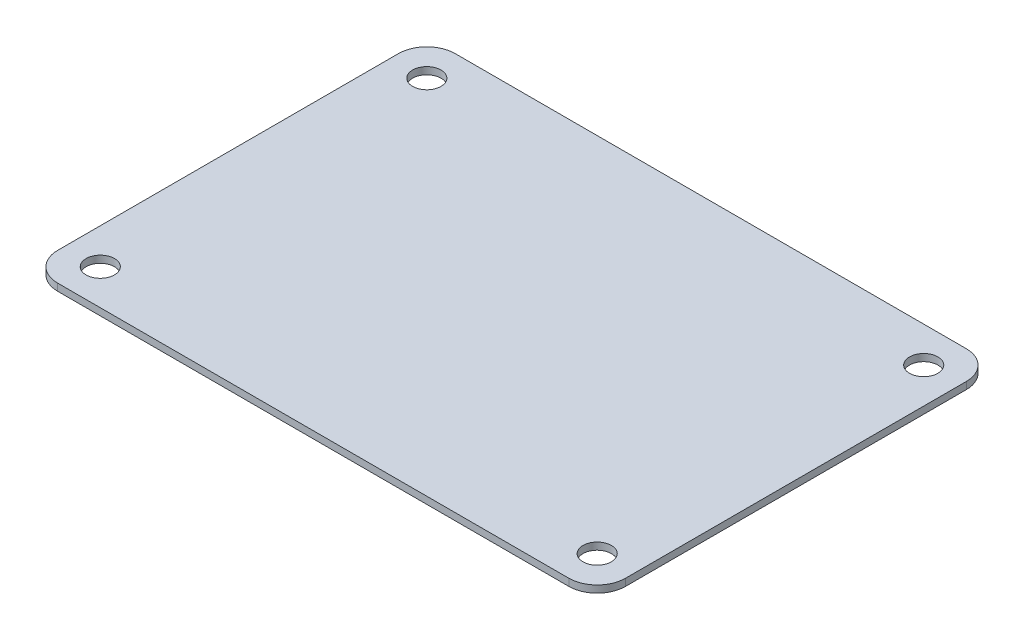
ISO-10303-21;
HEADER;
FILE_DESCRIPTION(('STEP AP214'),'2;1');
FILE_NAME('part.step','',(''),(''),'','','');
FILE_SCHEMA(('AUTOMOTIVE_DESIGN { 1 0 10303 214 1 1 1 1 }'));
ENDSEC;
DATA;
#1=APPLICATION_CONTEXT('core data for automotive mechanical design processes');
#2=APPLICATION_PROTOCOL_DEFINITION('international standard','automotive_design',2000,#1);
#3=PRODUCT_CONTEXT('',#1,'mechanical');
#4=PRODUCT('Part','Part','',(#3));
#5=PRODUCT_RELATED_PRODUCT_CATEGORY('part','',(#4));
#6=PRODUCT_DEFINITION_FORMATION('','',#4);
#7=PRODUCT_DEFINITION_CONTEXT('part definition',#1,'design');
#8=PRODUCT_DEFINITION('design','',#6,#7);
#9=PRODUCT_DEFINITION_SHAPE('','',#8);
#10=(LENGTH_UNIT() NAMED_UNIT(*) SI_UNIT(.MILLI.,.METRE.));
#11=(NAMED_UNIT(*) PLANE_ANGLE_UNIT() SI_UNIT($,.RADIAN.));
#12=(NAMED_UNIT(*) SI_UNIT($,.STERADIAN.) SOLID_ANGLE_UNIT());
#13=UNCERTAINTY_MEASURE_WITH_UNIT(LENGTH_MEASURE(1.E-05),#10,'distance_accuracy_value','');
#14=(GEOMETRIC_REPRESENTATION_CONTEXT(3) GLOBAL_UNCERTAINTY_ASSIGNED_CONTEXT((#13)) GLOBAL_UNIT_ASSIGNED_CONTEXT((#10,
#11,#12)) REPRESENTATION_CONTEXT('',''));
#15=CARTESIAN_POINT('',(0.,0.,0.));
#16=DIRECTION('',(0.,0.,1.));
#17=DIRECTION('',(1.,0.,0.));
#18=AXIS2_PLACEMENT_3D('',#15,#16,#17);
#19=CARTESIAN_POINT('',(0.,3.175,0.));
#20=DIRECTION('',(0.,1.,0.));
#21=DIRECTION('',(0.,0.,1.));
#22=AXIS2_PLACEMENT_3D('',#19,#20,#21);
#23=PLANE('',#22);
#24=CARTESIAN_POINT('',(111.125,3.175,-73.025));
#25=DIRECTION('',(0.,1.,0.));
#26=DIRECTION('',(0.,0.,1.));
#27=AXIS2_PLACEMENT_3D('',#24,#25,#26);
#28=CIRCLE('',#27,6.34999999999999);
#29=CARTESIAN_POINT('',(111.125,3.175,-66.675));
#30=VERTEX_POINT('',#29);
#31=EDGE_CURVE('E222',#30,#30,#28,.T.);
#32=ORIENTED_EDGE('',*,*,#31,.F.);
#33=EDGE_LOOP('',(#32));
#34=FACE_BOUND('',#33,.T.);
#35=CARTESIAN_POINT('',(-111.125,3.175,73.025));
#36=DIRECTION('',(0.,1.,0.));
#37=DIRECTION('',(0.,0.,1.));
#38=AXIS2_PLACEMENT_3D('',#35,#36,#37);
#39=CIRCLE('',#38,6.34999999999999);
#40=CARTESIAN_POINT('',(-111.125,3.175,79.375));
#41=VERTEX_POINT('',#40);
#42=EDGE_CURVE('E142',#41,#41,#39,.T.);
#43=ORIENTED_EDGE('',*,*,#42,.F.);
#44=EDGE_LOOP('',(#43));
#45=FACE_BOUND('',#44,.T.);
#46=DIRECTION('',(-1.,0.,0.));
#47=VECTOR('',#46,1.);
#48=CARTESIAN_POINT('',(-127.,3.175,-88.9));
#49=LINE('',#48,#47);
#50=CARTESIAN_POINT('',(114.3,3.175,-88.9));
#51=VERTEX_POINT('',#50);
#52=CARTESIAN_POINT('',(-114.3,3.175,-88.9));
#53=VERTEX_POINT('',#52);
#54=EDGE_CURVE('E152',#51,#53,#49,.T.);
#55=ORIENTED_EDGE('',*,*,#54,.T.);
#56=CARTESIAN_POINT('',(-114.3,3.175,-76.2));
#57=DIRECTION('',(0.,1.,0.));
#58=DIRECTION('',(0.,0.,1.));
#59=AXIS2_PLACEMENT_3D('',#56,#57,#58);
#60=CIRCLE('',#59,12.7);
#61=CARTESIAN_POINT('',(-127.,3.175,-76.2));
#62=VERTEX_POINT('',#61);
#63=EDGE_CURVE('E198',#53,#62,#60,.T.);
#64=ORIENTED_EDGE('',*,*,#63,.T.);
#65=DIRECTION('',(0.,0.,1.));
#66=VECTOR('',#65,1.);
#67=CARTESIAN_POINT('',(-127.,3.175,-88.9));
#68=LINE('',#67,#66);
#69=CARTESIAN_POINT('',(-127.,3.175,76.2));
#70=VERTEX_POINT('',#69);
#71=EDGE_CURVE('E132',#62,#70,#68,.T.);
#72=ORIENTED_EDGE('',*,*,#71,.T.);
#73=CARTESIAN_POINT('',(-114.3,3.175,76.2));
#74=DIRECTION('',(0.,1.,0.));
#75=DIRECTION('',(0.,0.,1.));
#76=AXIS2_PLACEMENT_3D('',#73,#74,#75);
#77=CIRCLE('',#76,12.7);
#78=CARTESIAN_POINT('',(-114.3,3.175,88.9));
#79=VERTEX_POINT('',#78);
#80=EDGE_CURVE('E195',#70,#79,#77,.T.);
#81=ORIENTED_EDGE('',*,*,#80,.T.);
#82=DIRECTION('',(1.,0.,0.));
#83=VECTOR('',#82,1.);
#84=CARTESIAN_POINT('',(-127.,3.175,88.9));
#85=LINE('',#84,#83);
#86=CARTESIAN_POINT('',(114.3,3.175,88.9));
#87=VERTEX_POINT('',#86);
#88=EDGE_CURVE('E184',#79,#87,#85,.T.);
#89=ORIENTED_EDGE('',*,*,#88,.T.);
#90=CARTESIAN_POINT('',(114.3,3.175,76.2));
#91=DIRECTION('',(0.,1.,0.));
#92=DIRECTION('',(0.,0.,1.));
#93=AXIS2_PLACEMENT_3D('',#90,#91,#92);
#94=CIRCLE('',#93,12.7);
#95=CARTESIAN_POINT('',(127.,3.175,76.2));
#96=VERTEX_POINT('',#95);
#97=EDGE_CURVE('E62',#87,#96,#94,.T.);
#98=ORIENTED_EDGE('',*,*,#97,.T.);
#99=DIRECTION('',(0.,0.,-1.));
#100=VECTOR('',#99,1.);
#101=CARTESIAN_POINT('',(127.,3.175,-88.9));
#102=LINE('',#101,#100);
#103=CARTESIAN_POINT('',(127.,3.175,-76.2));
#104=VERTEX_POINT('',#103);
#105=EDGE_CURVE('E181',#96,#104,#102,.T.);
#106=ORIENTED_EDGE('',*,*,#105,.T.);
#107=CARTESIAN_POINT('',(114.3,3.175,-76.2));
#108=DIRECTION('',(0.,1.,0.));
#109=DIRECTION('',(0.,0.,1.));
#110=AXIS2_PLACEMENT_3D('',#107,#108,#109);
#111=CIRCLE('',#110,12.7);
#112=EDGE_CURVE('E172',#104,#51,#111,.T.);
#113=ORIENTED_EDGE('',*,*,#112,.T.);
#114=EDGE_LOOP('',(#55,#64,#72,#81,#89,#98,#106,#113));
#115=FACE_BOUND('',#114,.T.);
#116=CARTESIAN_POINT('',(-111.125,3.175,-73.025));
#117=DIRECTION('',(0.,1.,0.));
#118=DIRECTION('',(0.,0.,1.));
#119=AXIS2_PLACEMENT_3D('',#116,#117,#118);
#120=CIRCLE('',#119,6.34999999999999);
#121=CARTESIAN_POINT('',(-111.125,3.175,-66.675));
#122=VERTEX_POINT('',#121);
#123=EDGE_CURVE('E246',#122,#122,#120,.T.);
#124=ORIENTED_EDGE('',*,*,#123,.F.);
#125=EDGE_LOOP('',(#124));
#126=FACE_BOUND('',#125,.T.);
#127=CARTESIAN_POINT('',(111.125,3.175,73.025));
#128=DIRECTION('',(0.,1.,0.));
#129=DIRECTION('',(0.,0.,1.));
#130=AXIS2_PLACEMENT_3D('',#127,#128,#129);
#131=CIRCLE('',#130,6.34999999999999);
#132=CARTESIAN_POINT('',(111.125,3.175,79.375));
#133=VERTEX_POINT('',#132);
#134=EDGE_CURVE('E229',#133,#133,#131,.T.);
#135=ORIENTED_EDGE('',*,*,#134,.F.);
#136=EDGE_LOOP('',(#135));
#137=FACE_BOUND('',#136,.T.);
#138=ADVANCED_FACE('F42',(#34,#45,#115,#126,#137),#23,.T.);
#139=CARTESIAN_POINT('',(0.,0.,0.));
#140=DIRECTION('',(0.,1.,0.));
#141=DIRECTION('',(0.,0.,1.));
#142=AXIS2_PLACEMENT_3D('',#139,#140,#141);
#143=PLANE('',#142);
#144=DIRECTION('',(0.,0.,1.));
#145=VECTOR('',#144,1.);
#146=CARTESIAN_POINT('',(-127.,0.,-88.9));
#147=LINE('',#146,#145);
#148=CARTESIAN_POINT('',(-127.,0.,-76.2));
#149=VERTEX_POINT('',#148);
#150=CARTESIAN_POINT('',(-127.,0.,76.2));
#151=VERTEX_POINT('',#150);
#152=EDGE_CURVE('E129',#149,#151,#147,.T.);
#153=ORIENTED_EDGE('',*,*,#152,.F.);
#154=CARTESIAN_POINT('',(-114.3,0.,-76.2));
#155=DIRECTION('',(0.,1.,0.));
#156=DIRECTION('',(0.,0.,1.));
#157=AXIS2_PLACEMENT_3D('',#154,#155,#156);
#158=CIRCLE('',#157,12.7);
#159=CARTESIAN_POINT('',(-114.3,0.,-88.9));
#160=VERTEX_POINT('',#159);
#161=EDGE_CURVE('E111',#149,#160,#158,.F.);
#162=ORIENTED_EDGE('',*,*,#161,.T.);
#163=DIRECTION('',(-1.,0.,0.));
#164=VECTOR('',#163,1.);
#165=CARTESIAN_POINT('',(-127.,0.,-88.9));
#166=LINE('',#165,#164);
#167=CARTESIAN_POINT('',(114.3,0.,-88.9));
#168=VERTEX_POINT('',#167);
#169=EDGE_CURVE('E157',#168,#160,#166,.T.);
#170=ORIENTED_EDGE('',*,*,#169,.F.);
#171=CARTESIAN_POINT('',(114.3,0.,-76.2));
#172=DIRECTION('',(0.,1.,0.));
#173=DIRECTION('',(0.,0.,1.));
#174=AXIS2_PLACEMENT_3D('',#171,#172,#173);
#175=CIRCLE('',#174,12.7);
#176=CARTESIAN_POINT('',(127.,0.,-76.2));
#177=VERTEX_POINT('',#176);
#178=EDGE_CURVE('E162',#168,#177,#175,.F.);
#179=ORIENTED_EDGE('',*,*,#178,.T.);
#180=DIRECTION('',(0.,0.,-1.));
#181=VECTOR('',#180,1.);
#182=CARTESIAN_POINT('',(127.,0.,-88.9));
#183=LINE('',#182,#181);
#184=CARTESIAN_POINT('',(127.,0.,76.2));
#185=VERTEX_POINT('',#184);
#186=EDGE_CURVE('E145',#185,#177,#183,.T.);
#187=ORIENTED_EDGE('',*,*,#186,.F.);
#188=CARTESIAN_POINT('',(114.3,0.,76.2));
#189=DIRECTION('',(0.,1.,0.));
#190=DIRECTION('',(0.,0.,1.));
#191=AXIS2_PLACEMENT_3D('',#188,#189,#190);
#192=CIRCLE('',#191,12.7);
#193=CARTESIAN_POINT('',(114.3,0.,88.9));
#194=VERTEX_POINT('',#193);
#195=EDGE_CURVE('E134',#185,#194,#192,.F.);
#196=ORIENTED_EDGE('',*,*,#195,.T.);
#197=DIRECTION('',(1.,0.,0.));
#198=VECTOR('',#197,1.);
#199=CARTESIAN_POINT('',(-127.,0.,88.9));
#200=LINE('',#199,#198);
#201=CARTESIAN_POINT('',(-114.3,0.,88.9));
#202=VERTEX_POINT('',#201);
#203=EDGE_CURVE('E141',#202,#194,#200,.T.);
#204=ORIENTED_EDGE('',*,*,#203,.F.);
#205=CARTESIAN_POINT('',(-114.3,0.,76.2));
#206=DIRECTION('',(0.,1.,0.));
#207=DIRECTION('',(0.,0.,1.));
#208=AXIS2_PLACEMENT_3D('',#205,#206,#207);
#209=CIRCLE('',#208,12.7);
#210=EDGE_CURVE('E123',#202,#151,#209,.F.);
#211=ORIENTED_EDGE('',*,*,#210,.T.);
#212=EDGE_LOOP('',(#153,#162,#170,#179,#187,#196,#204,#211));
#213=FACE_BOUND('',#212,.T.);
#214=CARTESIAN_POINT('',(-111.125,0.,73.025));
#215=DIRECTION('',(0.,1.,0.));
#216=DIRECTION('',(0.,0.,1.));
#217=AXIS2_PLACEMENT_3D('',#214,#215,#216);
#218=CIRCLE('',#217,6.34999999999999);
#219=CARTESIAN_POINT('',(-111.125,0.,79.375));
#220=VERTEX_POINT('',#219);
#221=EDGE_CURVE('E149',#220,#220,#218,.T.);
#222=ORIENTED_EDGE('',*,*,#221,.T.);
#223=EDGE_LOOP('',(#222));
#224=FACE_BOUND('',#223,.T.);
#225=CARTESIAN_POINT('',(-111.125,0.,-73.025));
#226=DIRECTION('',(0.,1.,0.));
#227=DIRECTION('',(0.,0.,1.));
#228=AXIS2_PLACEMENT_3D('',#225,#226,#227);
#229=CIRCLE('',#228,6.34999999999999);
#230=CARTESIAN_POINT('',(-111.125,0.,-66.675));
#231=VERTEX_POINT('',#230);
#232=EDGE_CURVE('E224',#231,#231,#229,.T.);
#233=ORIENTED_EDGE('',*,*,#232,.T.);
#234=EDGE_LOOP('',(#233));
#235=FACE_BOUND('',#234,.T.);
#236=CARTESIAN_POINT('',(111.125,0.,-73.025));
#237=DIRECTION('',(0.,1.,0.));
#238=DIRECTION('',(0.,0.,1.));
#239=AXIS2_PLACEMENT_3D('',#236,#237,#238);
#240=CIRCLE('',#239,6.34999999999999);
#241=CARTESIAN_POINT('',(111.125,0.,-66.675));
#242=VERTEX_POINT('',#241);
#243=EDGE_CURVE('E225',#242,#242,#240,.T.);
#244=ORIENTED_EDGE('',*,*,#243,.T.);
#245=EDGE_LOOP('',(#244));
#246=FACE_BOUND('',#245,.T.);
#247=CARTESIAN_POINT('',(111.125,0.,73.025));
#248=DIRECTION('',(0.,1.,0.));
#249=DIRECTION('',(0.,0.,1.));
#250=AXIS2_PLACEMENT_3D('',#247,#248,#249);
#251=CIRCLE('',#250,6.34999999999999);
#252=CARTESIAN_POINT('',(111.125,0.,79.375));
#253=VERTEX_POINT('',#252);
#254=EDGE_CURVE('E231',#253,#253,#251,.T.);
#255=ORIENTED_EDGE('',*,*,#254,.T.);
#256=EDGE_LOOP('',(#255));
#257=FACE_BOUND('',#256,.T.);
#258=ADVANCED_FACE('F137',(#213,#224,#235,#246,#257),#143,.F.);
#259=CARTESIAN_POINT('',(-127.,3.175,-88.9));
#260=DIRECTION('',(1.,0.,0.));
#261=DIRECTION('',(0.,0.,-1.));
#262=AXIS2_PLACEMENT_3D('',#259,#260,#261);
#263=PLANE('',#262);
#264=ORIENTED_EDGE('',*,*,#71,.F.);
#265=DIRECTION('',(0.,-1.,0.));
#266=VECTOR('',#265,1.);
#267=CARTESIAN_POINT('',(-127.,3.175,-76.2));
#268=LINE('',#267,#266);
#269=EDGE_CURVE('E115',#62,#149,#268,.T.);
#270=ORIENTED_EDGE('',*,*,#269,.T.);
#271=ORIENTED_EDGE('',*,*,#152,.T.);
#272=DIRECTION('',(0.,-1.,0.));
#273=VECTOR('',#272,1.);
#274=CARTESIAN_POINT('',(-127.,3.175,76.2));
#275=LINE('',#274,#273);
#276=EDGE_CURVE('E135',#151,#70,#275,.F.);
#277=ORIENTED_EDGE('',*,*,#276,.T.);
#278=EDGE_LOOP('',(#264,#270,#271,#277));
#279=FACE_BOUND('',#278,.T.);
#280=ADVANCED_FACE('F128',(#279),#263,.F.);
#281=CARTESIAN_POINT('',(-127.,3.175,88.9));
#282=DIRECTION('',(0.,0.,-1.));
#283=DIRECTION('',(-1.,0.,0.));
#284=AXIS2_PLACEMENT_3D('',#281,#282,#283);
#285=PLANE('',#284);
#286=ORIENTED_EDGE('',*,*,#88,.F.);
#287=DIRECTION('',(0.,-1.,0.));
#288=VECTOR('',#287,1.);
#289=CARTESIAN_POINT('',(-114.3,3.175,88.9));
#290=LINE('',#289,#288);
#291=EDGE_CURVE('E204',#79,#202,#290,.T.);
#292=ORIENTED_EDGE('',*,*,#291,.T.);
#293=ORIENTED_EDGE('',*,*,#203,.T.);
#294=DIRECTION('',(0.,-1.,0.));
#295=VECTOR('',#294,1.);
#296=CARTESIAN_POINT('',(114.3,3.175,88.9));
#297=LINE('',#296,#295);
#298=EDGE_CURVE('E202',#194,#87,#297,.F.);
#299=ORIENTED_EDGE('',*,*,#298,.T.);
#300=EDGE_LOOP('',(#286,#292,#293,#299));
#301=FACE_BOUND('',#300,.T.);
#302=ADVANCED_FACE('F280',(#301),#285,.F.);
#303=CARTESIAN_POINT('',(127.,3.175,-88.9));
#304=DIRECTION('',(-1.,0.,0.));
#305=DIRECTION('',(0.,0.,1.));
#306=AXIS2_PLACEMENT_3D('',#303,#304,#305);
#307=PLANE('',#306);
#308=ORIENTED_EDGE('',*,*,#186,.T.);
#309=DIRECTION('',(0.,-1.,0.));
#310=VECTOR('',#309,1.);
#311=CARTESIAN_POINT('',(127.,3.175,-76.2));
#312=LINE('',#311,#310);
#313=EDGE_CURVE('E12',#177,#104,#312,.F.);
#314=ORIENTED_EDGE('',*,*,#313,.T.);
#315=ORIENTED_EDGE('',*,*,#105,.F.);
#316=DIRECTION('',(0.,-1.,0.));
#317=VECTOR('',#316,1.);
#318=CARTESIAN_POINT('',(127.,3.175,76.2));
#319=LINE('',#318,#317);
#320=EDGE_CURVE('E50',#96,#185,#319,.T.);
#321=ORIENTED_EDGE('',*,*,#320,.T.);
#322=EDGE_LOOP('',(#308,#314,#315,#321));
#323=FACE_BOUND('',#322,.T.);
#324=ADVANCED_FACE('F209',(#323),#307,.F.);
#325=CARTESIAN_POINT('',(-127.,3.175,-88.9));
#326=DIRECTION('',(0.,0.,1.));
#327=DIRECTION('',(1.,0.,0.));
#328=AXIS2_PLACEMENT_3D('',#325,#326,#327);
#329=PLANE('',#328);
#330=ORIENTED_EDGE('',*,*,#169,.T.);
#331=DIRECTION('',(0.,-1.,0.));
#332=VECTOR('',#331,1.);
#333=CARTESIAN_POINT('',(-114.3,3.175,-88.9));
#334=LINE('',#333,#332);
#335=EDGE_CURVE('E116',#160,#53,#334,.F.);
#336=ORIENTED_EDGE('',*,*,#335,.T.);
#337=ORIENTED_EDGE('',*,*,#54,.F.);
#338=DIRECTION('',(0.,-1.,0.));
#339=VECTOR('',#338,1.);
#340=CARTESIAN_POINT('',(114.3,3.175,-88.9));
#341=LINE('',#340,#339);
#342=EDGE_CURVE('E122',#51,#168,#341,.T.);
#343=ORIENTED_EDGE('',*,*,#342,.T.);
#344=EDGE_LOOP('',(#330,#336,#337,#343));
#345=FACE_BOUND('',#344,.T.);
#346=ADVANCED_FACE('F217',(#345),#329,.F.);
#347=CARTESIAN_POINT('',(-111.125,3.175,73.025));
#348=DIRECTION('',(0.,-1.,0.));
#349=DIRECTION('',(0.,0.,-1.));
#350=AXIS2_PLACEMENT_3D('',#347,#348,#349);
#351=CYLINDRICAL_SURFACE('',#350,6.34999999999999);
#352=ORIENTED_EDGE('',*,*,#42,.T.);
#353=EDGE_LOOP('',(#352));
#354=FACE_BOUND('',#353,.T.);
#355=ORIENTED_EDGE('',*,*,#221,.F.);
#356=EDGE_LOOP('',(#355));
#357=FACE_BOUND('',#356,.T.);
#358=ADVANCED_FACE('F256',(#354,#357),#351,.F.);
#359=CARTESIAN_POINT('',(-111.125,3.175,-73.025));
#360=DIRECTION('',(0.,-1.,0.));
#361=DIRECTION('',(0.,0.,-1.));
#362=AXIS2_PLACEMENT_3D('',#359,#360,#361);
#363=CYLINDRICAL_SURFACE('',#362,6.34999999999999);
#364=ORIENTED_EDGE('',*,*,#123,.T.);
#365=EDGE_LOOP('',(#364));
#366=FACE_BOUND('',#365,.T.);
#367=ORIENTED_EDGE('',*,*,#232,.F.);
#368=EDGE_LOOP('',(#367));
#369=FACE_BOUND('',#368,.T.);
#370=ADVANCED_FACE('F258',(#366,#369),#363,.F.);
#371=CARTESIAN_POINT('',(111.125,3.175,-73.025));
#372=DIRECTION('',(0.,-1.,0.));
#373=DIRECTION('',(0.,0.,-1.));
#374=AXIS2_PLACEMENT_3D('',#371,#372,#373);
#375=CYLINDRICAL_SURFACE('',#374,6.34999999999999);
#376=ORIENTED_EDGE('',*,*,#31,.T.);
#377=EDGE_LOOP('',(#376));
#378=FACE_BOUND('',#377,.T.);
#379=ORIENTED_EDGE('',*,*,#243,.F.);
#380=EDGE_LOOP('',(#379));
#381=FACE_BOUND('',#380,.T.);
#382=ADVANCED_FACE('F265',(#378,#381),#375,.F.);
#383=CARTESIAN_POINT('',(111.125,3.175,73.025));
#384=DIRECTION('',(0.,-1.,0.));
#385=DIRECTION('',(0.,0.,-1.));
#386=AXIS2_PLACEMENT_3D('',#383,#384,#385);
#387=CYLINDRICAL_SURFACE('',#386,6.34999999999999);
#388=ORIENTED_EDGE('',*,*,#134,.T.);
#389=EDGE_LOOP('',(#388));
#390=FACE_BOUND('',#389,.T.);
#391=ORIENTED_EDGE('',*,*,#254,.F.);
#392=EDGE_LOOP('',(#391));
#393=FACE_BOUND('',#392,.T.);
#394=ADVANCED_FACE('F289',(#390,#393),#387,.F.);
#395=CARTESIAN_POINT('',(-114.3,3.175,-76.2));
#396=DIRECTION('',(0.,-1.,0.));
#397=DIRECTION('',(0.,0.,-1.));
#398=AXIS2_PLACEMENT_3D('',#395,#396,#397);
#399=CYLINDRICAL_SURFACE('',#398,12.7);
#400=ORIENTED_EDGE('',*,*,#63,.F.);
#401=ORIENTED_EDGE('',*,*,#335,.F.);
#402=ORIENTED_EDGE('',*,*,#161,.F.);
#403=ORIENTED_EDGE('',*,*,#269,.F.);
#404=EDGE_LOOP('',(#400,#401,#402,#403));
#405=FACE_BOUND('',#404,.T.);
#406=ADVANCED_FACE('F114',(#405),#399,.T.);
#407=CARTESIAN_POINT('',(-114.3,3.175,76.2));
#408=DIRECTION('',(0.,-1.,0.));
#409=DIRECTION('',(0.,0.,-1.));
#410=AXIS2_PLACEMENT_3D('',#407,#408,#409);
#411=CYLINDRICAL_SURFACE('',#410,12.7);
#412=ORIENTED_EDGE('',*,*,#80,.F.);
#413=ORIENTED_EDGE('',*,*,#276,.F.);
#414=ORIENTED_EDGE('',*,*,#210,.F.);
#415=ORIENTED_EDGE('',*,*,#291,.F.);
#416=EDGE_LOOP('',(#412,#413,#414,#415));
#417=FACE_BOUND('',#416,.T.);
#418=ADVANCED_FACE('F288',(#417),#411,.T.);
#419=CARTESIAN_POINT('',(114.3,3.175,-76.2));
#420=DIRECTION('',(0.,-1.,0.));
#421=DIRECTION('',(0.,0.,-1.));
#422=AXIS2_PLACEMENT_3D('',#419,#420,#421);
#423=CYLINDRICAL_SURFACE('',#422,12.7);
#424=ORIENTED_EDGE('',*,*,#112,.F.);
#425=ORIENTED_EDGE('',*,*,#313,.F.);
#426=ORIENTED_EDGE('',*,*,#178,.F.);
#427=ORIENTED_EDGE('',*,*,#342,.F.);
#428=EDGE_LOOP('',(#424,#425,#426,#427));
#429=FACE_BOUND('',#428,.T.);
#430=ADVANCED_FACE('F214',(#429),#423,.T.);
#431=CARTESIAN_POINT('',(114.3,3.175,76.2));
#432=DIRECTION('',(0.,-1.,0.));
#433=DIRECTION('',(0.,0.,-1.));
#434=AXIS2_PLACEMENT_3D('',#431,#432,#433);
#435=CYLINDRICAL_SURFACE('',#434,12.7);
#436=ORIENTED_EDGE('',*,*,#97,.F.);
#437=ORIENTED_EDGE('',*,*,#298,.F.);
#438=ORIENTED_EDGE('',*,*,#195,.F.);
#439=ORIENTED_EDGE('',*,*,#320,.F.);
#440=EDGE_LOOP('',(#436,#437,#438,#439));
#441=FACE_BOUND('',#440,.T.);
#442=ADVANCED_FACE('F44',(#441),#435,.T.);
#443=CLOSED_SHELL('',(#138,#258,#280,#302,#324,#346,#358,#370,#382,#394,#406,#418,#430,#442));
#444=MANIFOLD_SOLID_BREP('B2',#443);
#445=ADVANCED_BREP_SHAPE_REPRESENTATION('',(#18,#444),#14);
#446=SHAPE_DEFINITION_REPRESENTATION(#9,#445);
ENDSEC;
END-ISO-10303-21;
